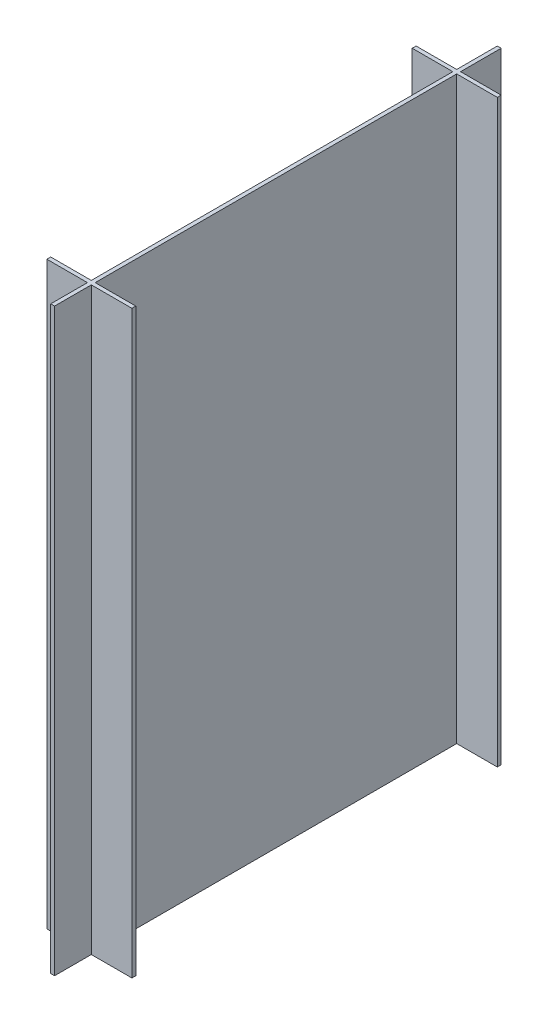
ISO-10303-21;
HEADER;
FILE_DESCRIPTION(('STEP AP214'),'2;1');
FILE_NAME('part.step','',(''),(''),'','','');
FILE_SCHEMA(('AUTOMOTIVE_DESIGN { 1 0 10303 214 1 1 1 1 }'));
ENDSEC;
DATA;
#1=APPLICATION_CONTEXT('core data for automotive mechanical design processes');
#2=APPLICATION_PROTOCOL_DEFINITION('international standard','automotive_design',2000,#1);
#3=PRODUCT_CONTEXT('',#1,'mechanical');
#4=PRODUCT('Part','Part','',(#3));
#5=PRODUCT_RELATED_PRODUCT_CATEGORY('part','',(#4));
#6=PRODUCT_DEFINITION_FORMATION('','',#4);
#7=PRODUCT_DEFINITION_CONTEXT('part definition',#1,'design');
#8=PRODUCT_DEFINITION('design','',#6,#7);
#9=PRODUCT_DEFINITION_SHAPE('','',#8);
#10=(LENGTH_UNIT() NAMED_UNIT(*) SI_UNIT(.MILLI.,.METRE.));
#11=(NAMED_UNIT(*) PLANE_ANGLE_UNIT() SI_UNIT($,.RADIAN.));
#12=(NAMED_UNIT(*) SI_UNIT($,.STERADIAN.) SOLID_ANGLE_UNIT());
#13=UNCERTAINTY_MEASURE_WITH_UNIT(LENGTH_MEASURE(1.E-05),#10,'distance_accuracy_value','');
#14=(GEOMETRIC_REPRESENTATION_CONTEXT(3) GLOBAL_UNCERTAINTY_ASSIGNED_CONTEXT((#13)) GLOBAL_UNIT_ASSIGNED_CONTEXT((#10,
#11,#12)) REPRESENTATION_CONTEXT('',''));
#15=CARTESIAN_POINT('',(0.,0.,0.));
#16=DIRECTION('',(0.,0.,1.));
#17=DIRECTION('',(1.,0.,0.));
#18=AXIS2_PLACEMENT_3D('',#15,#16,#17);
#19=CARTESIAN_POINT('',(-56.1616111521953,300.,42.3022668872637));
#20=DIRECTION('',(1.,0.,0.));
#21=DIRECTION('',(0.,0.,-1.));
#22=AXIS2_PLACEMENT_3D('',#19,#20,#21);
#23=PLANE('',#22);
#24=DIRECTION('',(0.,0.,1.));
#25=VECTOR('',#24,1.);
#26=CARTESIAN_POINT('',(-56.1616111521953,0.,42.3022668872637));
#27=LINE('',#26,#25);
#28=CARTESIAN_POINT('',(-56.1616111521953,0.,42.3022668872637));
#29=VERTEX_POINT('',#28);
#30=CARTESIAN_POINT('',(-56.1616111521953,0.,44.3022668872637));
#31=VERTEX_POINT('',#30);
#32=EDGE_CURVE('E206',#29,#31,#27,.T.);
#33=ORIENTED_EDGE('',*,*,#32,.T.);
#34=DIRECTION('',(0.,-1.,0.));
#35=VECTOR('',#34,1.);
#36=CARTESIAN_POINT('',(-56.1616111521953,300.,44.3022668872637));
#37=LINE('',#36,#35);
#38=CARTESIAN_POINT('',(-56.1616111521953,300.,44.3022668872637));
#39=VERTEX_POINT('',#38);
#40=EDGE_CURVE('E11',#39,#31,#37,.T.);
#41=ORIENTED_EDGE('',*,*,#40,.F.);
#42=DIRECTION('',(0.,0.,1.));
#43=VECTOR('',#42,1.);
#44=CARTESIAN_POINT('',(-56.1616111521953,300.,42.3022668872637));
#45=LINE('',#44,#43);
#46=CARTESIAN_POINT('',(-56.1616111521953,300.,42.3022668872637));
#47=VERTEX_POINT('',#46);
#48=EDGE_CURVE('E244',#47,#39,#45,.T.);
#49=ORIENTED_EDGE('',*,*,#48,.F.);
#50=DIRECTION('',(0.,-1.,0.));
#51=VECTOR('',#50,1.);
#52=CARTESIAN_POINT('',(-56.1616111521953,300.,42.3022668872637));
#53=LINE('',#52,#51);
#54=EDGE_CURVE('E202',#47,#29,#53,.T.);
#55=ORIENTED_EDGE('',*,*,#54,.T.);
#56=EDGE_LOOP('',(#33,#41,#49,#55));
#57=FACE_BOUND('',#56,.T.);
#58=ADVANCED_FACE('F38',(#57),#23,.F.);
#59=CARTESIAN_POINT('',(-56.1616111521953,300.,44.3022668872637));
#60=DIRECTION('',(0.,0.,-1.));
#61=DIRECTION('',(-1.,0.,0.));
#62=AXIS2_PLACEMENT_3D('',#59,#60,#61);
#63=PLANE('',#62);
#64=DIRECTION('',(1.,0.,0.));
#65=VECTOR('',#64,1.);
#66=CARTESIAN_POINT('',(-56.1616111521953,0.,44.3022668872637));
#67=LINE('',#66,#65);
#68=CARTESIAN_POINT('',(-35.1616111521953,0.,44.3022668872637));
#69=VERTEX_POINT('',#68);
#70=EDGE_CURVE('E209',#31,#69,#67,.T.);
#71=ORIENTED_EDGE('',*,*,#70,.T.);
#72=DIRECTION('',(0.,-1.,0.));
#73=VECTOR('',#72,1.);
#74=CARTESIAN_POINT('',(-35.1616111521953,300.,44.3022668872637));
#75=LINE('',#74,#73);
#76=CARTESIAN_POINT('',(-35.1616111521953,300.,44.3022668872637));
#77=VERTEX_POINT('',#76);
#78=EDGE_CURVE('E46',#77,#69,#75,.T.);
#79=ORIENTED_EDGE('',*,*,#78,.F.);
#80=DIRECTION('',(1.,0.,0.));
#81=VECTOR('',#80,1.);
#82=CARTESIAN_POINT('',(-56.1616111521953,300.,44.3022668872637));
#83=LINE('',#82,#81);
#84=EDGE_CURVE('E133',#39,#77,#83,.T.);
#85=ORIENTED_EDGE('',*,*,#84,.F.);
#86=ORIENTED_EDGE('',*,*,#40,.T.);
#87=EDGE_LOOP('',(#71,#79,#85,#86));
#88=FACE_BOUND('',#87,.T.);
#89=ADVANCED_FACE('F362',(#88),#63,.F.);
#90=CARTESIAN_POINT('',(-35.1616111521953,300.,44.3022668872637));
#91=DIRECTION('',(1.,0.,0.));
#92=DIRECTION('',(0.,0.,-1.));
#93=AXIS2_PLACEMENT_3D('',#90,#91,#92);
#94=PLANE('',#93);
#95=DIRECTION('',(0.,0.,1.));
#96=VECTOR('',#95,1.);
#97=CARTESIAN_POINT('',(-35.1616111521953,0.,44.3022668872637));
#98=LINE('',#97,#96);
#99=CARTESIAN_POINT('',(-35.1616111521953,0.,231.302266887264));
#100=VERTEX_POINT('',#99);
#101=EDGE_CURVE('E211',#69,#100,#98,.T.);
#102=ORIENTED_EDGE('',*,*,#101,.T.);
#103=DIRECTION('',(0.,-1.,0.));
#104=VECTOR('',#103,1.);
#105=CARTESIAN_POINT('',(-35.1616111521953,300.,231.302266887264));
#106=LINE('',#105,#104);
#107=CARTESIAN_POINT('',(-35.1616111521953,300.,231.302266887264));
#108=VERTEX_POINT('',#107);
#109=EDGE_CURVE('E287',#108,#100,#106,.T.);
#110=ORIENTED_EDGE('',*,*,#109,.F.);
#111=DIRECTION('',(0.,0.,1.));
#112=VECTOR('',#111,1.);
#113=CARTESIAN_POINT('',(-35.1616111521953,300.,44.3022668872637));
#114=LINE('',#113,#112);
#115=EDGE_CURVE('E295',#77,#108,#114,.T.);
#116=ORIENTED_EDGE('',*,*,#115,.F.);
#117=ORIENTED_EDGE('',*,*,#78,.T.);
#118=EDGE_LOOP('',(#102,#110,#116,#117));
#119=FACE_BOUND('',#118,.T.);
#120=ADVANCED_FACE('F293',(#119),#94,.F.);
#121=CARTESIAN_POINT('',(-35.1616111521953,300.,231.302266887264));
#122=DIRECTION('',(0.,0.,1.));
#123=DIRECTION('',(1.,0.,0.));
#124=AXIS2_PLACEMENT_3D('',#121,#122,#123);
#125=PLANE('',#124);
#126=DIRECTION('',(-1.,0.,0.));
#127=VECTOR('',#126,1.);
#128=CARTESIAN_POINT('',(-35.1616111521953,0.,231.302266887264));
#129=LINE('',#128,#127);
#130=CARTESIAN_POINT('',(-56.1616111521953,0.,231.302266887264));
#131=VERTEX_POINT('',#130);
#132=EDGE_CURVE('E213',#100,#131,#129,.T.);
#133=ORIENTED_EDGE('',*,*,#132,.T.);
#134=DIRECTION('',(0.,-1.,0.));
#135=VECTOR('',#134,1.);
#136=CARTESIAN_POINT('',(-56.1616111521953,300.,231.302266887264));
#137=LINE('',#136,#135);
#138=CARTESIAN_POINT('',(-56.1616111521953,300.,231.302266887264));
#139=VERTEX_POINT('',#138);
#140=EDGE_CURVE('E284',#139,#131,#137,.T.);
#141=ORIENTED_EDGE('',*,*,#140,.F.);
#142=DIRECTION('',(-1.,0.,0.));
#143=VECTOR('',#142,1.);
#144=CARTESIAN_POINT('',(-35.1616111521953,300.,231.302266887264));
#145=LINE('',#144,#143);
#146=EDGE_CURVE('E313',#108,#139,#145,.T.);
#147=ORIENTED_EDGE('',*,*,#146,.F.);
#148=ORIENTED_EDGE('',*,*,#109,.T.);
#149=EDGE_LOOP('',(#133,#141,#147,#148));
#150=FACE_BOUND('',#149,.T.);
#151=ADVANCED_FACE('F304',(#150),#125,.F.);
#152=CARTESIAN_POINT('',(-56.1616111521953,300.,231.302266887264));
#153=DIRECTION('',(1.,0.,0.));
#154=DIRECTION('',(0.,0.,-1.));
#155=AXIS2_PLACEMENT_3D('',#152,#153,#154);
#156=PLANE('',#155);
#157=DIRECTION('',(0.,0.,1.));
#158=VECTOR('',#157,1.);
#159=CARTESIAN_POINT('',(-56.1616111521953,0.,231.302266887264));
#160=LINE('',#159,#158);
#161=CARTESIAN_POINT('',(-56.1616111521953,0.,233.302266887264));
#162=VERTEX_POINT('',#161);
#163=EDGE_CURVE('E215',#131,#162,#160,.T.);
#164=ORIENTED_EDGE('',*,*,#163,.T.);
#165=DIRECTION('',(0.,-1.,0.));
#166=VECTOR('',#165,1.);
#167=CARTESIAN_POINT('',(-56.1616111521953,300.,233.302266887264));
#168=LINE('',#167,#166);
#169=CARTESIAN_POINT('',(-56.1616111521953,300.,233.302266887264));
#170=VERTEX_POINT('',#169);
#171=EDGE_CURVE('E281',#170,#162,#168,.T.);
#172=ORIENTED_EDGE('',*,*,#171,.F.);
#173=DIRECTION('',(0.,0.,1.));
#174=VECTOR('',#173,1.);
#175=CARTESIAN_POINT('',(-56.1616111521953,300.,231.302266887264));
#176=LINE('',#175,#174);
#177=EDGE_CURVE('E310',#139,#170,#176,.T.);
#178=ORIENTED_EDGE('',*,*,#177,.F.);
#179=ORIENTED_EDGE('',*,*,#140,.T.);
#180=EDGE_LOOP('',(#164,#172,#178,#179));
#181=FACE_BOUND('',#180,.T.);
#182=ADVANCED_FACE('F308',(#181),#156,.F.);
#183=CARTESIAN_POINT('',(-56.1616111521953,300.,233.302266887264));
#184=DIRECTION('',(0.,0.,-1.));
#185=DIRECTION('',(-1.,0.,0.));
#186=AXIS2_PLACEMENT_3D('',#183,#184,#185);
#187=PLANE('',#186);
#188=DIRECTION('',(1.,0.,0.));
#189=VECTOR('',#188,1.);
#190=CARTESIAN_POINT('',(-56.1616111521953,0.,233.302266887264));
#191=LINE('',#190,#189);
#192=CARTESIAN_POINT('',(-35.1616111521953,0.,233.302266887264));
#193=VERTEX_POINT('',#192);
#194=EDGE_CURVE('E217',#162,#193,#191,.T.);
#195=ORIENTED_EDGE('',*,*,#194,.T.);
#196=DIRECTION('',(0.,-1.,0.));
#197=VECTOR('',#196,1.);
#198=CARTESIAN_POINT('',(-35.1616111521953,300.,233.302266887264));
#199=LINE('',#198,#197);
#200=CARTESIAN_POINT('',(-35.1616111521953,300.,233.302266887264));
#201=VERTEX_POINT('',#200);
#202=EDGE_CURVE('E278',#201,#193,#199,.T.);
#203=ORIENTED_EDGE('',*,*,#202,.F.);
#204=DIRECTION('',(1.,0.,0.));
#205=VECTOR('',#204,1.);
#206=CARTESIAN_POINT('',(-56.1616111521953,300.,233.302266887264));
#207=LINE('',#206,#205);
#208=EDGE_CURVE('E312',#170,#201,#207,.T.);
#209=ORIENTED_EDGE('',*,*,#208,.F.);
#210=ORIENTED_EDGE('',*,*,#171,.T.);
#211=EDGE_LOOP('',(#195,#203,#209,#210));
#212=FACE_BOUND('',#211,.T.);
#213=ADVANCED_FACE('F375',(#212),#187,.F.);
#214=CARTESIAN_POINT('',(-35.1616111521953,300.,233.302266887264));
#215=DIRECTION('',(1.,0.,0.));
#216=DIRECTION('',(0.,0.,-1.));
#217=AXIS2_PLACEMENT_3D('',#214,#215,#216);
#218=PLANE('',#217);
#219=DIRECTION('',(0.,0.,1.));
#220=VECTOR('',#219,1.);
#221=CARTESIAN_POINT('',(-35.1616111521953,0.,233.302266887264));
#222=LINE('',#221,#220);
#223=CARTESIAN_POINT('',(-35.1616111521953,0.,252.302266887264));
#224=VERTEX_POINT('',#223);
#225=EDGE_CURVE('E219',#193,#224,#222,.T.);
#226=ORIENTED_EDGE('',*,*,#225,.T.);
#227=DIRECTION('',(0.,-1.,0.));
#228=VECTOR('',#227,1.);
#229=CARTESIAN_POINT('',(-35.1616111521953,300.,252.302266887264));
#230=LINE('',#229,#228);
#231=CARTESIAN_POINT('',(-35.1616111521953,300.,252.302266887264));
#232=VERTEX_POINT('',#231);
#233=EDGE_CURVE('E275',#232,#224,#230,.T.);
#234=ORIENTED_EDGE('',*,*,#233,.F.);
#235=DIRECTION('',(0.,0.,1.));
#236=VECTOR('',#235,1.);
#237=CARTESIAN_POINT('',(-35.1616111521953,300.,233.302266887264));
#238=LINE('',#237,#236);
#239=EDGE_CURVE('E315',#201,#232,#238,.T.);
#240=ORIENTED_EDGE('',*,*,#239,.F.);
#241=ORIENTED_EDGE('',*,*,#202,.T.);
#242=EDGE_LOOP('',(#226,#234,#240,#241));
#243=FACE_BOUND('',#242,.T.);
#244=ADVANCED_FACE('F378',(#243),#218,.F.);
#245=CARTESIAN_POINT('',(-35.1616111521953,300.,252.302266887264));
#246=DIRECTION('',(0.,0.,-1.));
#247=DIRECTION('',(-1.,0.,0.));
#248=AXIS2_PLACEMENT_3D('',#245,#246,#247);
#249=PLANE('',#248);
#250=DIRECTION('',(1.,0.,0.));
#251=VECTOR('',#250,1.);
#252=CARTESIAN_POINT('',(-35.1616111521953,0.,252.302266887264));
#253=LINE('',#252,#251);
#254=CARTESIAN_POINT('',(-33.1616111521953,0.,252.302266887264));
#255=VERTEX_POINT('',#254);
#256=EDGE_CURVE('E221',#224,#255,#253,.T.);
#257=ORIENTED_EDGE('',*,*,#256,.T.);
#258=DIRECTION('',(0.,-1.,0.));
#259=VECTOR('',#258,1.);
#260=CARTESIAN_POINT('',(-33.1616111521953,300.,252.302266887264));
#261=LINE('',#260,#259);
#262=CARTESIAN_POINT('',(-33.1616111521953,300.,252.302266887264));
#263=VERTEX_POINT('',#262);
#264=EDGE_CURVE('E272',#263,#255,#261,.T.);
#265=ORIENTED_EDGE('',*,*,#264,.F.);
#266=DIRECTION('',(1.,0.,0.));
#267=VECTOR('',#266,1.);
#268=CARTESIAN_POINT('',(-35.1616111521953,300.,252.302266887264));
#269=LINE('',#268,#267);
#270=EDGE_CURVE('E321',#232,#263,#269,.T.);
#271=ORIENTED_EDGE('',*,*,#270,.F.);
#272=ORIENTED_EDGE('',*,*,#233,.T.);
#273=EDGE_LOOP('',(#257,#265,#271,#272));
#274=FACE_BOUND('',#273,.T.);
#275=ADVANCED_FACE('F382',(#274),#249,.F.);
#276=CARTESIAN_POINT('',(-33.1616111521953,300.,233.302266887264));
#277=DIRECTION('',(-1.,0.,0.));
#278=DIRECTION('',(0.,0.,1.));
#279=AXIS2_PLACEMENT_3D('',#276,#277,#278);
#280=PLANE('',#279);
#281=DIRECTION('',(0.,0.,-1.));
#282=VECTOR('',#281,1.);
#283=CARTESIAN_POINT('',(-33.1616111521953,0.,233.302266887264));
#284=LINE('',#283,#282);
#285=CARTESIAN_POINT('',(-33.1616111521953,0.,233.302266887264));
#286=VERTEX_POINT('',#285);
#287=EDGE_CURVE('E223',#255,#286,#284,.T.);
#288=ORIENTED_EDGE('',*,*,#287,.T.);
#289=DIRECTION('',(0.,-1.,0.));
#290=VECTOR('',#289,1.);
#291=CARTESIAN_POINT('',(-33.1616111521953,300.,233.302266887264));
#292=LINE('',#291,#290);
#293=CARTESIAN_POINT('',(-33.1616111521953,300.,233.302266887264));
#294=VERTEX_POINT('',#293);
#295=EDGE_CURVE('E269',#294,#286,#292,.T.);
#296=ORIENTED_EDGE('',*,*,#295,.F.);
#297=DIRECTION('',(0.,0.,-1.));
#298=VECTOR('',#297,1.);
#299=CARTESIAN_POINT('',(-33.1616111521953,300.,233.302266887264));
#300=LINE('',#299,#298);
#301=EDGE_CURVE('E323',#263,#294,#300,.T.);
#302=ORIENTED_EDGE('',*,*,#301,.F.);
#303=ORIENTED_EDGE('',*,*,#264,.T.);
#304=EDGE_LOOP('',(#288,#296,#302,#303));
#305=FACE_BOUND('',#304,.T.);
#306=ADVANCED_FACE('F386',(#305),#280,.F.);
#307=CARTESIAN_POINT('',(-33.1616111521953,300.,233.302266887264));
#308=DIRECTION('',(0.,0.,-1.));
#309=DIRECTION('',(-1.,0.,0.));
#310=AXIS2_PLACEMENT_3D('',#307,#308,#309);
#311=PLANE('',#310);
#312=DIRECTION('',(1.,0.,0.));
#313=VECTOR('',#312,1.);
#314=CARTESIAN_POINT('',(-33.1616111521953,0.,233.302266887264));
#315=LINE('',#314,#313);
#316=CARTESIAN_POINT('',(-12.1616111521953,0.,233.302266887264));
#317=VERTEX_POINT('',#316);
#318=EDGE_CURVE('E225',#286,#317,#315,.T.);
#319=ORIENTED_EDGE('',*,*,#318,.T.);
#320=DIRECTION('',(0.,-1.,0.));
#321=VECTOR('',#320,1.);
#322=CARTESIAN_POINT('',(-12.1616111521953,300.,233.302266887264));
#323=LINE('',#322,#321);
#324=CARTESIAN_POINT('',(-12.1616111521953,300.,233.302266887264));
#325=VERTEX_POINT('',#324);
#326=EDGE_CURVE('E266',#325,#317,#323,.T.);
#327=ORIENTED_EDGE('',*,*,#326,.F.);
#328=DIRECTION('',(1.,0.,0.));
#329=VECTOR('',#328,1.);
#330=CARTESIAN_POINT('',(-33.1616111521953,300.,233.302266887264));
#331=LINE('',#330,#329);
#332=EDGE_CURVE('E325',#294,#325,#331,.T.);
#333=ORIENTED_EDGE('',*,*,#332,.F.);
#334=ORIENTED_EDGE('',*,*,#295,.T.);
#335=EDGE_LOOP('',(#319,#327,#333,#334));
#336=FACE_BOUND('',#335,.T.);
#337=ADVANCED_FACE('F390',(#336),#311,.F.);
#338=CARTESIAN_POINT('',(-12.1616111521953,300.,231.302266887264));
#339=DIRECTION('',(-1.,0.,0.));
#340=DIRECTION('',(0.,0.,1.));
#341=AXIS2_PLACEMENT_3D('',#338,#339,#340);
#342=PLANE('',#341);
#343=DIRECTION('',(0.,0.,-1.));
#344=VECTOR('',#343,1.);
#345=CARTESIAN_POINT('',(-12.1616111521953,0.,231.302266887264));
#346=LINE('',#345,#344);
#347=CARTESIAN_POINT('',(-12.1616111521953,0.,231.302266887264));
#348=VERTEX_POINT('',#347);
#349=EDGE_CURVE('E227',#317,#348,#346,.T.);
#350=ORIENTED_EDGE('',*,*,#349,.T.);
#351=DIRECTION('',(0.,-1.,0.));
#352=VECTOR('',#351,1.);
#353=CARTESIAN_POINT('',(-12.1616111521953,300.,231.302266887264));
#354=LINE('',#353,#352);
#355=CARTESIAN_POINT('',(-12.1616111521953,300.,231.302266887264));
#356=VERTEX_POINT('',#355);
#357=EDGE_CURVE('E263',#356,#348,#354,.T.);
#358=ORIENTED_EDGE('',*,*,#357,.F.);
#359=DIRECTION('',(0.,0.,-1.));
#360=VECTOR('',#359,1.);
#361=CARTESIAN_POINT('',(-12.1616111521953,300.,231.302266887264));
#362=LINE('',#361,#360);
#363=EDGE_CURVE('E327',#325,#356,#362,.T.);
#364=ORIENTED_EDGE('',*,*,#363,.F.);
#365=ORIENTED_EDGE('',*,*,#326,.T.);
#366=EDGE_LOOP('',(#350,#358,#364,#365));
#367=FACE_BOUND('',#366,.T.);
#368=ADVANCED_FACE('F394',(#367),#342,.F.);
#369=CARTESIAN_POINT('',(-33.1616111521953,300.,231.302266887264));
#370=DIRECTION('',(0.,0.,1.));
#371=DIRECTION('',(1.,0.,0.));
#372=AXIS2_PLACEMENT_3D('',#369,#370,#371);
#373=PLANE('',#372);
#374=DIRECTION('',(-1.,0.,0.));
#375=VECTOR('',#374,1.);
#376=CARTESIAN_POINT('',(-33.1616111521953,0.,231.302266887264));
#377=LINE('',#376,#375);
#378=CARTESIAN_POINT('',(-33.1616111521953,0.,231.302266887264));
#379=VERTEX_POINT('',#378);
#380=EDGE_CURVE('E229',#348,#379,#377,.T.);
#381=ORIENTED_EDGE('',*,*,#380,.T.);
#382=DIRECTION('',(0.,-1.,0.));
#383=VECTOR('',#382,1.);
#384=CARTESIAN_POINT('',(-33.1616111521953,300.,231.302266887264));
#385=LINE('',#384,#383);
#386=CARTESIAN_POINT('',(-33.1616111521953,300.,231.302266887264));
#387=VERTEX_POINT('',#386);
#388=EDGE_CURVE('E260',#387,#379,#385,.T.);
#389=ORIENTED_EDGE('',*,*,#388,.F.);
#390=DIRECTION('',(-1.,0.,0.));
#391=VECTOR('',#390,1.);
#392=CARTESIAN_POINT('',(-33.1616111521953,300.,231.302266887264));
#393=LINE('',#392,#391);
#394=EDGE_CURVE('E329',#356,#387,#393,.T.);
#395=ORIENTED_EDGE('',*,*,#394,.F.);
#396=ORIENTED_EDGE('',*,*,#357,.T.);
#397=EDGE_LOOP('',(#381,#389,#395,#396));
#398=FACE_BOUND('',#397,.T.);
#399=ADVANCED_FACE('F398',(#398),#373,.F.);
#400=CARTESIAN_POINT('',(-33.1616111521953,300.,44.3022668872637));
#401=DIRECTION('',(-1.,0.,0.));
#402=DIRECTION('',(0.,0.,1.));
#403=AXIS2_PLACEMENT_3D('',#400,#401,#402);
#404=PLANE('',#403);
#405=DIRECTION('',(0.,0.,-1.));
#406=VECTOR('',#405,1.);
#407=CARTESIAN_POINT('',(-33.1616111521953,0.,44.3022668872637));
#408=LINE('',#407,#406);
#409=CARTESIAN_POINT('',(-33.1616111521953,0.,44.3022668872637));
#410=VERTEX_POINT('',#409);
#411=EDGE_CURVE('E231',#379,#410,#408,.T.);
#412=ORIENTED_EDGE('',*,*,#411,.T.);
#413=DIRECTION('',(0.,-1.,0.));
#414=VECTOR('',#413,1.);
#415=CARTESIAN_POINT('',(-33.1616111521953,300.,44.3022668872637));
#416=LINE('',#415,#414);
#417=CARTESIAN_POINT('',(-33.1616111521953,300.,44.3022668872637));
#418=VERTEX_POINT('',#417);
#419=EDGE_CURVE('E257',#418,#410,#416,.T.);
#420=ORIENTED_EDGE('',*,*,#419,.F.);
#421=DIRECTION('',(0.,0.,-1.));
#422=VECTOR('',#421,1.);
#423=CARTESIAN_POINT('',(-33.1616111521953,300.,44.3022668872637));
#424=LINE('',#423,#422);
#425=EDGE_CURVE('E331',#387,#418,#424,.T.);
#426=ORIENTED_EDGE('',*,*,#425,.F.);
#427=ORIENTED_EDGE('',*,*,#388,.T.);
#428=EDGE_LOOP('',(#412,#420,#426,#427));
#429=FACE_BOUND('',#428,.T.);
#430=ADVANCED_FACE('F402',(#429),#404,.F.);
#431=CARTESIAN_POINT('',(-33.1616111521953,300.,44.3022668872637));
#432=DIRECTION('',(0.,0.,-1.));
#433=DIRECTION('',(-1.,0.,0.));
#434=AXIS2_PLACEMENT_3D('',#431,#432,#433);
#435=PLANE('',#434);
#436=DIRECTION('',(1.,0.,0.));
#437=VECTOR('',#436,1.);
#438=CARTESIAN_POINT('',(-33.1616111521953,0.,44.3022668872637));
#439=LINE('',#438,#437);
#440=CARTESIAN_POINT('',(-12.1616111521953,0.,44.3022668872637));
#441=VERTEX_POINT('',#440);
#442=EDGE_CURVE('E233',#410,#441,#439,.T.);
#443=ORIENTED_EDGE('',*,*,#442,.T.);
#444=DIRECTION('',(0.,-1.,0.));
#445=VECTOR('',#444,1.);
#446=CARTESIAN_POINT('',(-12.1616111521953,300.,44.3022668872637));
#447=LINE('',#446,#445);
#448=CARTESIAN_POINT('',(-12.1616111521953,300.,44.3022668872637));
#449=VERTEX_POINT('',#448);
#450=EDGE_CURVE('E254',#449,#441,#447,.T.);
#451=ORIENTED_EDGE('',*,*,#450,.F.);
#452=DIRECTION('',(1.,0.,0.));
#453=VECTOR('',#452,1.);
#454=CARTESIAN_POINT('',(-33.1616111521953,300.,44.3022668872637));
#455=LINE('',#454,#453);
#456=EDGE_CURVE('E333',#418,#449,#455,.T.);
#457=ORIENTED_EDGE('',*,*,#456,.F.);
#458=ORIENTED_EDGE('',*,*,#419,.T.);
#459=EDGE_LOOP('',(#443,#451,#457,#458));
#460=FACE_BOUND('',#459,.T.);
#461=ADVANCED_FACE('F406',(#460),#435,.F.);
#462=CARTESIAN_POINT('',(-12.1616111521953,300.,42.3022668872637));
#463=DIRECTION('',(-1.,0.,0.));
#464=DIRECTION('',(0.,0.,1.));
#465=AXIS2_PLACEMENT_3D('',#462,#463,#464);
#466=PLANE('',#465);
#467=DIRECTION('',(0.,0.,-1.));
#468=VECTOR('',#467,1.);
#469=CARTESIAN_POINT('',(-12.1616111521953,0.,42.3022668872637));
#470=LINE('',#469,#468);
#471=CARTESIAN_POINT('',(-12.1616111521953,0.,42.3022668872637));
#472=VERTEX_POINT('',#471);
#473=EDGE_CURVE('E235',#441,#472,#470,.T.);
#474=ORIENTED_EDGE('',*,*,#473,.T.);
#475=DIRECTION('',(0.,-1.,0.));
#476=VECTOR('',#475,1.);
#477=CARTESIAN_POINT('',(-12.1616111521953,300.,42.3022668872637));
#478=LINE('',#477,#476);
#479=CARTESIAN_POINT('',(-12.1616111521953,300.,42.3022668872637));
#480=VERTEX_POINT('',#479);
#481=EDGE_CURVE('E251',#480,#472,#478,.T.);
#482=ORIENTED_EDGE('',*,*,#481,.F.);
#483=DIRECTION('',(0.,0.,-1.));
#484=VECTOR('',#483,1.);
#485=CARTESIAN_POINT('',(-12.1616111521953,300.,42.3022668872637));
#486=LINE('',#485,#484);
#487=EDGE_CURVE('E335',#449,#480,#486,.T.);
#488=ORIENTED_EDGE('',*,*,#487,.F.);
#489=ORIENTED_EDGE('',*,*,#450,.T.);
#490=EDGE_LOOP('',(#474,#482,#488,#489));
#491=FACE_BOUND('',#490,.T.);
#492=ADVANCED_FACE('F410',(#491),#466,.F.);
#493=CARTESIAN_POINT('',(-33.1616111521953,300.,42.3022668872637));
#494=DIRECTION('',(0.,0.,1.));
#495=DIRECTION('',(1.,0.,0.));
#496=AXIS2_PLACEMENT_3D('',#493,#494,#495);
#497=PLANE('',#496);
#498=DIRECTION('',(-1.,0.,0.));
#499=VECTOR('',#498,1.);
#500=CARTESIAN_POINT('',(-33.1616111521953,0.,42.3022668872637));
#501=LINE('',#500,#499);
#502=CARTESIAN_POINT('',(-33.1616111521953,0.,42.3022668872637));
#503=VERTEX_POINT('',#502);
#504=EDGE_CURVE('E237',#472,#503,#501,.T.);
#505=ORIENTED_EDGE('',*,*,#504,.T.);
#506=DIRECTION('',(0.,-1.,0.));
#507=VECTOR('',#506,1.);
#508=CARTESIAN_POINT('',(-33.1616111521953,300.,42.3022668872637));
#509=LINE('',#508,#507);
#510=CARTESIAN_POINT('',(-33.1616111521953,300.,42.3022668872637));
#511=VERTEX_POINT('',#510);
#512=EDGE_CURVE('E248',#511,#503,#509,.T.);
#513=ORIENTED_EDGE('',*,*,#512,.F.);
#514=DIRECTION('',(-1.,0.,0.));
#515=VECTOR('',#514,1.);
#516=CARTESIAN_POINT('',(-33.1616111521953,300.,42.3022668872637));
#517=LINE('',#516,#515);
#518=EDGE_CURVE('E337',#480,#511,#517,.T.);
#519=ORIENTED_EDGE('',*,*,#518,.F.);
#520=ORIENTED_EDGE('',*,*,#481,.T.);
#521=EDGE_LOOP('',(#505,#513,#519,#520));
#522=FACE_BOUND('',#521,.T.);
#523=ADVANCED_FACE('F343',(#522),#497,.F.);
#524=CARTESIAN_POINT('',(-33.1616111521953,300.,42.3022668872637));
#525=DIRECTION('',(-1.,0.,0.));
#526=DIRECTION('',(0.,0.,1.));
#527=AXIS2_PLACEMENT_3D('',#524,#525,#526);
#528=PLANE('',#527);
#529=DIRECTION('',(0.,0.,-1.));
#530=VECTOR('',#529,1.);
#531=CARTESIAN_POINT('',(-33.1616111521953,0.,42.3022668872637));
#532=LINE('',#531,#530);
#533=CARTESIAN_POINT('',(-33.1616111521953,0.,21.3022668872637));
#534=VERTEX_POINT('',#533);
#535=EDGE_CURVE('E239',#503,#534,#532,.T.);
#536=ORIENTED_EDGE('',*,*,#535,.T.);
#537=DIRECTION('',(0.,-1.,0.));
#538=VECTOR('',#537,1.);
#539=CARTESIAN_POINT('',(-33.1616111521953,300.,21.3022668872637));
#540=LINE('',#539,#538);
#541=CARTESIAN_POINT('',(-33.1616111521953,300.,21.3022668872637));
#542=VERTEX_POINT('',#541);
#543=EDGE_CURVE('E197',#542,#534,#540,.T.);
#544=ORIENTED_EDGE('',*,*,#543,.F.);
#545=DIRECTION('',(0.,0.,-1.));
#546=VECTOR('',#545,1.);
#547=CARTESIAN_POINT('',(-33.1616111521953,300.,42.3022668872637));
#548=LINE('',#547,#546);
#549=EDGE_CURVE('E188',#511,#542,#548,.T.);
#550=ORIENTED_EDGE('',*,*,#549,.F.);
#551=ORIENTED_EDGE('',*,*,#512,.T.);
#552=EDGE_LOOP('',(#536,#544,#550,#551));
#553=FACE_BOUND('',#552,.T.);
#554=ADVANCED_FACE('F347',(#553),#528,.F.);
#555=CARTESIAN_POINT('',(-35.1616111521953,300.,21.3022668872637));
#556=DIRECTION('',(0.,0.,1.));
#557=DIRECTION('',(1.,0.,0.));
#558=AXIS2_PLACEMENT_3D('',#555,#556,#557);
#559=PLANE('',#558);
#560=DIRECTION('',(-1.,0.,0.));
#561=VECTOR('',#560,1.);
#562=CARTESIAN_POINT('',(-35.1616111521953,0.,21.3022668872637));
#563=LINE('',#562,#561);
#564=CARTESIAN_POINT('',(-35.1616111521953,0.,21.3022668872637));
#565=VERTEX_POINT('',#564);
#566=EDGE_CURVE('E196',#534,#565,#563,.T.);
#567=ORIENTED_EDGE('',*,*,#566,.T.);
#568=DIRECTION('',(0.,-1.,0.));
#569=VECTOR('',#568,1.);
#570=CARTESIAN_POINT('',(-35.1616111521953,300.,21.3022668872637));
#571=LINE('',#570,#569);
#572=CARTESIAN_POINT('',(-35.1616111521953,300.,21.3022668872637));
#573=VERTEX_POINT('',#572);
#574=EDGE_CURVE('E193',#573,#565,#571,.T.);
#575=ORIENTED_EDGE('',*,*,#574,.F.);
#576=DIRECTION('',(-1.,0.,0.));
#577=VECTOR('',#576,1.);
#578=CARTESIAN_POINT('',(-35.1616111521953,300.,21.3022668872637));
#579=LINE('',#578,#577);
#580=EDGE_CURVE('E182',#542,#573,#579,.T.);
#581=ORIENTED_EDGE('',*,*,#580,.F.);
#582=ORIENTED_EDGE('',*,*,#543,.T.);
#583=EDGE_LOOP('',(#567,#575,#581,#582));
#584=FACE_BOUND('',#583,.T.);
#585=ADVANCED_FACE('F194',(#584),#559,.F.);
#586=CARTESIAN_POINT('',(-35.1616111521953,300.,42.3022668872637));
#587=DIRECTION('',(1.,0.,0.));
#588=DIRECTION('',(0.,0.,-1.));
#589=AXIS2_PLACEMENT_3D('',#586,#587,#588);
#590=PLANE('',#589);
#591=DIRECTION('',(0.,0.,1.));
#592=VECTOR('',#591,1.);
#593=CARTESIAN_POINT('',(-35.1616111521953,0.,42.3022668872637));
#594=LINE('',#593,#592);
#595=CARTESIAN_POINT('',(-35.1616111521953,0.,42.3022668872637));
#596=VERTEX_POINT('',#595);
#597=EDGE_CURVE('E119',#565,#596,#594,.T.);
#598=ORIENTED_EDGE('',*,*,#597,.T.);
#599=DIRECTION('',(0.,-1.,0.));
#600=VECTOR('',#599,1.);
#601=CARTESIAN_POINT('',(-35.1616111521953,300.,42.3022668872637));
#602=LINE('',#601,#600);
#603=CARTESIAN_POINT('',(-35.1616111521953,300.,42.3022668872637));
#604=VERTEX_POINT('',#603);
#605=EDGE_CURVE('E198',#604,#596,#602,.T.);
#606=ORIENTED_EDGE('',*,*,#605,.F.);
#607=DIRECTION('',(0.,0.,1.));
#608=VECTOR('',#607,1.);
#609=CARTESIAN_POINT('',(-35.1616111521953,300.,42.3022668872637));
#610=LINE('',#609,#608);
#611=EDGE_CURVE('E186',#573,#604,#610,.T.);
#612=ORIENTED_EDGE('',*,*,#611,.F.);
#613=ORIENTED_EDGE('',*,*,#574,.T.);
#614=EDGE_LOOP('',(#598,#606,#612,#613));
#615=FACE_BOUND('',#614,.T.);
#616=ADVANCED_FACE('F200',(#615),#590,.F.);
#617=CARTESIAN_POINT('',(-56.1616111521953,300.,42.3022668872637));
#618=DIRECTION('',(0.,0.,1.));
#619=DIRECTION('',(1.,0.,0.));
#620=AXIS2_PLACEMENT_3D('',#617,#618,#619);
#621=PLANE('',#620);
#622=DIRECTION('',(-1.,0.,0.));
#623=VECTOR('',#622,1.);
#624=CARTESIAN_POINT('',(-56.1616111521953,0.,42.3022668872637));
#625=LINE('',#624,#623);
#626=EDGE_CURVE('E125',#596,#29,#625,.T.);
#627=ORIENTED_EDGE('',*,*,#626,.T.);
#628=ORIENTED_EDGE('',*,*,#54,.F.);
#629=DIRECTION('',(-1.,0.,0.));
#630=VECTOR('',#629,1.);
#631=CARTESIAN_POINT('',(-56.1616111521953,300.,42.3022668872637));
#632=LINE('',#631,#630);
#633=EDGE_CURVE('E54',#604,#47,#632,.T.);
#634=ORIENTED_EDGE('',*,*,#633,.F.);
#635=ORIENTED_EDGE('',*,*,#605,.T.);
#636=EDGE_LOOP('',(#627,#628,#634,#635));
#637=FACE_BOUND('',#636,.T.);
#638=ADVANCED_FACE('F351',(#637),#621,.F.);
#639=CARTESIAN_POINT('',(0.,300.,0.));
#640=DIRECTION('',(0.,1.,0.));
#641=DIRECTION('',(0.,0.,1.));
#642=AXIS2_PLACEMENT_3D('',#639,#640,#641);
#643=PLANE('',#642);
#644=ORIENTED_EDGE('',*,*,#48,.T.);
#645=ORIENTED_EDGE('',*,*,#84,.T.);
#646=ORIENTED_EDGE('',*,*,#115,.T.);
#647=ORIENTED_EDGE('',*,*,#146,.T.);
#648=ORIENTED_EDGE('',*,*,#177,.T.);
#649=ORIENTED_EDGE('',*,*,#208,.T.);
#650=ORIENTED_EDGE('',*,*,#239,.T.);
#651=ORIENTED_EDGE('',*,*,#270,.T.);
#652=ORIENTED_EDGE('',*,*,#301,.T.);
#653=ORIENTED_EDGE('',*,*,#332,.T.);
#654=ORIENTED_EDGE('',*,*,#363,.T.);
#655=ORIENTED_EDGE('',*,*,#394,.T.);
#656=ORIENTED_EDGE('',*,*,#425,.T.);
#657=ORIENTED_EDGE('',*,*,#456,.T.);
#658=ORIENTED_EDGE('',*,*,#487,.T.);
#659=ORIENTED_EDGE('',*,*,#518,.T.);
#660=ORIENTED_EDGE('',*,*,#549,.T.);
#661=ORIENTED_EDGE('',*,*,#580,.T.);
#662=ORIENTED_EDGE('',*,*,#611,.T.);
#663=ORIENTED_EDGE('',*,*,#633,.T.);
#664=EDGE_LOOP('',(#644,#645,#646,#647,#648,#649,#650,#651,#652,#653,#654,#655,#656,#657,#658,
#659,#660,#661,#662,#663));
#665=FACE_BOUND('',#664,.T.);
#666=ADVANCED_FACE('F184',(#665),#643,.T.);
#667=CARTESIAN_POINT('',(0.,0.,0.));
#668=DIRECTION('',(0.,1.,0.));
#669=DIRECTION('',(0.,0.,1.));
#670=AXIS2_PLACEMENT_3D('',#667,#668,#669);
#671=PLANE('',#670);
#672=ORIENTED_EDGE('',*,*,#32,.F.);
#673=ORIENTED_EDGE('',*,*,#626,.F.);
#674=ORIENTED_EDGE('',*,*,#597,.F.);
#675=ORIENTED_EDGE('',*,*,#566,.F.);
#676=ORIENTED_EDGE('',*,*,#535,.F.);
#677=ORIENTED_EDGE('',*,*,#504,.F.);
#678=ORIENTED_EDGE('',*,*,#473,.F.);
#679=ORIENTED_EDGE('',*,*,#442,.F.);
#680=ORIENTED_EDGE('',*,*,#411,.F.);
#681=ORIENTED_EDGE('',*,*,#380,.F.);
#682=ORIENTED_EDGE('',*,*,#349,.F.);
#683=ORIENTED_EDGE('',*,*,#318,.F.);
#684=ORIENTED_EDGE('',*,*,#287,.F.);
#685=ORIENTED_EDGE('',*,*,#256,.F.);
#686=ORIENTED_EDGE('',*,*,#225,.F.);
#687=ORIENTED_EDGE('',*,*,#194,.F.);
#688=ORIENTED_EDGE('',*,*,#163,.F.);
#689=ORIENTED_EDGE('',*,*,#132,.F.);
#690=ORIENTED_EDGE('',*,*,#101,.F.);
#691=ORIENTED_EDGE('',*,*,#70,.F.);
#692=EDGE_LOOP('',(#672,#673,#674,#675,#676,#677,#678,#679,#680,#681,#682,#683,#684,#685,#686,
#687,#688,#689,#690,#691));
#693=FACE_BOUND('',#692,.T.);
#694=ADVANCED_FACE('F299',(#693),#671,.F.);
#695=CLOSED_SHELL('',(#58,#89,#120,#151,#182,#213,#244,#275,#306,#337,#368,#399,#430,#461,#492,
#523,#554,#585,#616,#638,#666,#694));
#696=MANIFOLD_SOLID_BREP('B2',#695);
#697=ADVANCED_BREP_SHAPE_REPRESENTATION('',(#18,#696),#14);
#698=SHAPE_DEFINITION_REPRESENTATION(#9,#697);
ENDSEC;
END-ISO-10303-21;
